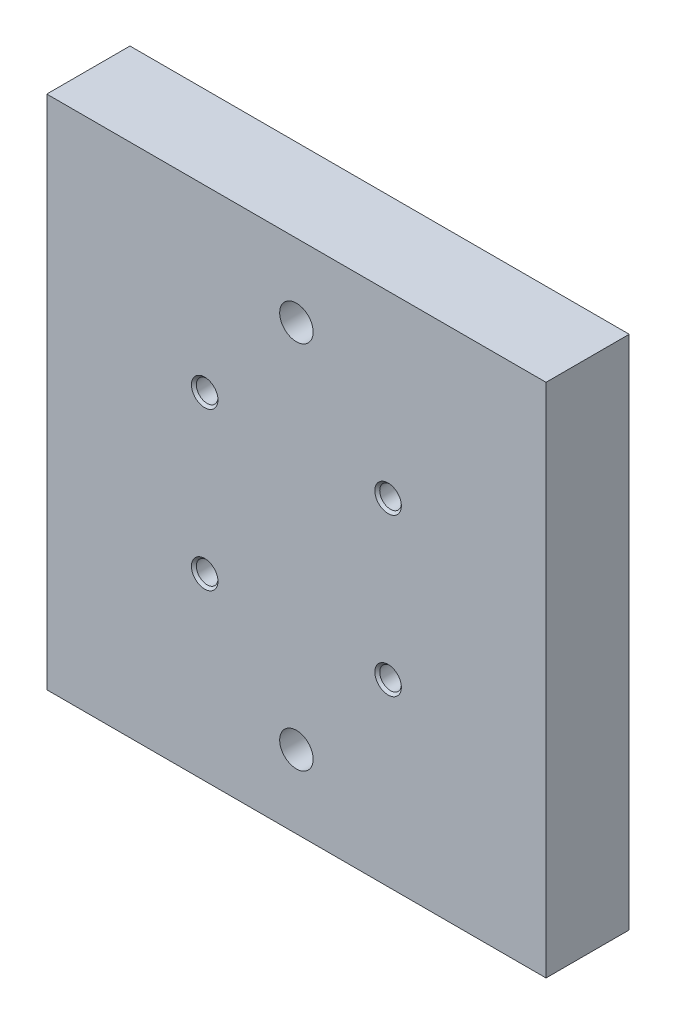
ISO-10303-21;
HEADER;
FILE_DESCRIPTION(('STEP AP214'),'2;1');
FILE_NAME('part.step','',(''),(''),'','','');
FILE_SCHEMA(('AUTOMOTIVE_DESIGN { 1 0 10303 214 1 1 1 1 }'));
ENDSEC;
DATA;
#1=APPLICATION_CONTEXT('core data for automotive mechanical design processes');
#2=APPLICATION_PROTOCOL_DEFINITION('international standard','automotive_design',2000,#1);
#3=PRODUCT_CONTEXT('',#1,'mechanical');
#4=PRODUCT('Part','Part','',(#3));
#5=PRODUCT_RELATED_PRODUCT_CATEGORY('part','',(#4));
#6=PRODUCT_DEFINITION_FORMATION('','',#4);
#7=PRODUCT_DEFINITION_CONTEXT('part definition',#1,'design');
#8=PRODUCT_DEFINITION('design','',#6,#7);
#9=PRODUCT_DEFINITION_SHAPE('','',#8);
#10=(LENGTH_UNIT() NAMED_UNIT(*) SI_UNIT(.MILLI.,.METRE.));
#11=(NAMED_UNIT(*) PLANE_ANGLE_UNIT() SI_UNIT($,.RADIAN.));
#12=(NAMED_UNIT(*) SI_UNIT($,.STERADIAN.) SOLID_ANGLE_UNIT());
#13=UNCERTAINTY_MEASURE_WITH_UNIT(LENGTH_MEASURE(1.E-05),#10,'distance_accuracy_value','');
#14=(GEOMETRIC_REPRESENTATION_CONTEXT(3) GLOBAL_UNCERTAINTY_ASSIGNED_CONTEXT((#13)) GLOBAL_UNIT_ASSIGNED_CONTEXT((#10,
#11,#12)) REPRESENTATION_CONTEXT('',''));
#15=CARTESIAN_POINT('',(0.,0.,0.));
#16=DIRECTION('',(0.,0.,1.));
#17=DIRECTION('',(1.,0.,0.));
#18=AXIS2_PLACEMENT_3D('',#15,#16,#17);
#19=CARTESIAN_POINT('',(-38.1,-39.37,12.7));
#20=DIRECTION('',(1.,0.,0.));
#21=DIRECTION('',(0.,0.,-1.));
#22=AXIS2_PLACEMENT_3D('',#19,#20,#21);
#23=PLANE('',#22);
#24=DIRECTION('',(0.,-1.,0.));
#25=VECTOR('',#24,1.);
#26=CARTESIAN_POINT('',(-38.1,-39.37,0.));
#27=LINE('',#26,#25);
#28=CARTESIAN_POINT('',(-38.1,39.37,0.));
#29=VERTEX_POINT('',#28);
#30=CARTESIAN_POINT('',(-38.1,-39.37,0.));
#31=VERTEX_POINT('',#30);
#32=EDGE_CURVE('E97',#29,#31,#27,.T.);
#33=ORIENTED_EDGE('',*,*,#32,.T.);
#34=DIRECTION('',(0.,0.,-1.));
#35=VECTOR('',#34,1.);
#36=CARTESIAN_POINT('',(-38.1,-39.37,12.7));
#37=LINE('',#36,#35);
#38=CARTESIAN_POINT('',(-38.1,-39.37,12.7));
#39=VERTEX_POINT('',#38);
#40=EDGE_CURVE('E11',#39,#31,#37,.T.);
#41=ORIENTED_EDGE('',*,*,#40,.F.);
#42=DIRECTION('',(0.,-1.,0.));
#43=VECTOR('',#42,1.);
#44=CARTESIAN_POINT('',(-38.1,-39.37,12.7));
#45=LINE('',#44,#43);
#46=CARTESIAN_POINT('',(-38.1,39.37,12.7));
#47=VERTEX_POINT('',#46);
#48=EDGE_CURVE('E85',#47,#39,#45,.T.);
#49=ORIENTED_EDGE('',*,*,#48,.F.);
#50=DIRECTION('',(0.,0.,-1.));
#51=VECTOR('',#50,1.);
#52=CARTESIAN_POINT('',(-38.1,39.37,12.7));
#53=LINE('',#52,#51);
#54=EDGE_CURVE('E93',#47,#29,#53,.T.);
#55=ORIENTED_EDGE('',*,*,#54,.T.);
#56=EDGE_LOOP('',(#33,#41,#49,#55));
#57=FACE_BOUND('',#56,.T.);
#58=ADVANCED_FACE('F34',(#57),#23,.F.);
#59=CARTESIAN_POINT('',(-38.1,-39.37,12.7));
#60=DIRECTION('',(0.,1.,0.));
#61=DIRECTION('',(-1.,0.,0.));
#62=AXIS2_PLACEMENT_3D('',#59,#60,#61);
#63=PLANE('',#62);
#64=DIRECTION('',(1.,0.,0.));
#65=VECTOR('',#64,1.);
#66=CARTESIAN_POINT('',(-38.1,-39.37,0.));
#67=LINE('',#66,#65);
#68=CARTESIAN_POINT('',(38.1,-39.37,0.));
#69=VERTEX_POINT('',#68);
#70=EDGE_CURVE('E89',#31,#69,#67,.T.);
#71=ORIENTED_EDGE('',*,*,#70,.T.);
#72=DIRECTION('',(0.,0.,-1.));
#73=VECTOR('',#72,1.);
#74=CARTESIAN_POINT('',(38.1,-39.37,12.7));
#75=LINE('',#74,#73);
#76=CARTESIAN_POINT('',(38.1,-39.37,12.7));
#77=VERTEX_POINT('',#76);
#78=EDGE_CURVE('E42',#77,#69,#75,.T.);
#79=ORIENTED_EDGE('',*,*,#78,.F.);
#80=DIRECTION('',(1.,0.,0.));
#81=VECTOR('',#80,1.);
#82=CARTESIAN_POINT('',(-38.1,-39.37,12.7));
#83=LINE('',#82,#81);
#84=EDGE_CURVE('E80',#39,#77,#83,.T.);
#85=ORIENTED_EDGE('',*,*,#84,.F.);
#86=ORIENTED_EDGE('',*,*,#40,.T.);
#87=EDGE_LOOP('',(#71,#79,#85,#86));
#88=FACE_BOUND('',#87,.T.);
#89=ADVANCED_FACE('F88',(#88),#63,.F.);
#90=CARTESIAN_POINT('',(38.1,-39.37,12.7));
#91=DIRECTION('',(-1.,0.,0.));
#92=DIRECTION('',(0.,0.,1.));
#93=AXIS2_PLACEMENT_3D('',#90,#91,#92);
#94=PLANE('',#93);
#95=DIRECTION('',(0.,1.,0.));
#96=VECTOR('',#95,1.);
#97=CARTESIAN_POINT('',(38.1,-39.37,0.));
#98=LINE('',#97,#96);
#99=CARTESIAN_POINT('',(38.1,39.37,0.));
#100=VERTEX_POINT('',#99);
#101=EDGE_CURVE('E67',#69,#100,#98,.T.);
#102=ORIENTED_EDGE('',*,*,#101,.T.);
#103=DIRECTION('',(0.,0.,-1.));
#104=VECTOR('',#103,1.);
#105=CARTESIAN_POINT('',(38.1,39.37,12.7));
#106=LINE('',#105,#104);
#107=CARTESIAN_POINT('',(38.1,39.37,12.7));
#108=VERTEX_POINT('',#107);
#109=EDGE_CURVE('E90',#108,#100,#106,.T.);
#110=ORIENTED_EDGE('',*,*,#109,.F.);
#111=DIRECTION('',(0.,1.,0.));
#112=VECTOR('',#111,1.);
#113=CARTESIAN_POINT('',(38.1,-39.37,12.7));
#114=LINE('',#113,#112);
#115=EDGE_CURVE('E83',#77,#108,#114,.T.);
#116=ORIENTED_EDGE('',*,*,#115,.F.);
#117=ORIENTED_EDGE('',*,*,#78,.T.);
#118=EDGE_LOOP('',(#102,#110,#116,#117));
#119=FACE_BOUND('',#118,.T.);
#120=ADVANCED_FACE('F91',(#119),#94,.F.);
#121=CARTESIAN_POINT('',(-38.1,39.37,12.7));
#122=DIRECTION('',(0.,-1.,0.));
#123=DIRECTION('',(1.,0.,0.));
#124=AXIS2_PLACEMENT_3D('',#121,#122,#123);
#125=PLANE('',#124);
#126=DIRECTION('',(-1.,0.,0.));
#127=VECTOR('',#126,1.);
#128=CARTESIAN_POINT('',(-38.1,39.37,0.));
#129=LINE('',#128,#127);
#130=EDGE_CURVE('E73',#100,#29,#129,.T.);
#131=ORIENTED_EDGE('',*,*,#130,.T.);
#132=ORIENTED_EDGE('',*,*,#54,.F.);
#133=DIRECTION('',(-1.,0.,0.));
#134=VECTOR('',#133,1.);
#135=CARTESIAN_POINT('',(-38.1,39.37,12.7));
#136=LINE('',#135,#134);
#137=EDGE_CURVE('E50',#108,#47,#136,.T.);
#138=ORIENTED_EDGE('',*,*,#137,.F.);
#139=ORIENTED_EDGE('',*,*,#109,.T.);
#140=EDGE_LOOP('',(#131,#132,#138,#139));
#141=FACE_BOUND('',#140,.T.);
#142=ADVANCED_FACE('F105',(#141),#125,.F.);
#143=CARTESIAN_POINT('',(0.,0.,12.7));
#144=DIRECTION('',(0.,0.,-1.));
#145=DIRECTION('',(-1.,0.,0.));
#146=AXIS2_PLACEMENT_3D('',#143,#144,#145);
#147=PLANE('',#146);
#148=CARTESIAN_POINT('',(13.9954,11.9888,12.7));
#149=DIRECTION('',(0.,0.,-1.));
#150=DIRECTION('',(-1.,0.,0.));
#151=AXIS2_PLACEMENT_3D('',#148,#149,#150);
#152=CIRCLE('',#151,2.025);
#153=CARTESIAN_POINT('',(11.9704,11.9888,12.7));
#154=VERTEX_POINT('',#153);
#155=EDGE_CURVE('E173',#154,#154,#152,.T.);
#156=ORIENTED_EDGE('',*,*,#155,.T.);
#157=EDGE_LOOP('',(#156));
#158=FACE_BOUND('',#157,.T.);
#159=CARTESIAN_POINT('',(-13.9954,11.9888,12.7));
#160=DIRECTION('',(0.,0.,-1.));
#161=DIRECTION('',(-1.,0.,0.));
#162=AXIS2_PLACEMENT_3D('',#159,#160,#161);
#163=CIRCLE('',#162,2.025);
#164=CARTESIAN_POINT('',(-16.0204,11.9888,12.7));
#165=VERTEX_POINT('',#164);
#166=EDGE_CURVE('E161',#165,#165,#163,.T.);
#167=ORIENTED_EDGE('',*,*,#166,.T.);
#168=EDGE_LOOP('',(#167));
#169=FACE_BOUND('',#168,.T.);
#170=CARTESIAN_POINT('',(-13.9954,-11.9888,12.7));
#171=DIRECTION('',(0.,0.,-1.));
#172=DIRECTION('',(-1.,0.,0.));
#173=AXIS2_PLACEMENT_3D('',#170,#171,#172);
#174=CIRCLE('',#173,2.025);
#175=CARTESIAN_POINT('',(-16.0204,-11.9888,12.7));
#176=VERTEX_POINT('',#175);
#177=EDGE_CURVE('E149',#176,#176,#174,.T.);
#178=ORIENTED_EDGE('',*,*,#177,.T.);
#179=EDGE_LOOP('',(#178));
#180=FACE_BOUND('',#179,.T.);
#181=CARTESIAN_POINT('',(13.9954,-11.9888,12.7));
#182=DIRECTION('',(0.,0.,-1.));
#183=DIRECTION('',(-1.,0.,0.));
#184=AXIS2_PLACEMENT_3D('',#181,#182,#183);
#185=CIRCLE('',#184,2.025);
#186=CARTESIAN_POINT('',(11.9704,-11.9888,12.7));
#187=VERTEX_POINT('',#186);
#188=EDGE_CURVE('E137',#187,#187,#185,.T.);
#189=ORIENTED_EDGE('',*,*,#188,.T.);
#190=EDGE_LOOP('',(#189));
#191=FACE_BOUND('',#190,.T.);
#192=CARTESIAN_POINT('',(0.,28.2321,12.7));
#193=DIRECTION('',(0.,0.,-1.));
#194=DIRECTION('',(-1.,0.,0.));
#195=AXIS2_PLACEMENT_3D('',#192,#193,#194);
#196=CIRCLE('',#195,2.55269999999999);
#197=CARTESIAN_POINT('',(-2.5527,28.2321,12.7));
#198=VERTEX_POINT('',#197);
#199=EDGE_CURVE('E119',#198,#198,#196,.T.);
#200=ORIENTED_EDGE('',*,*,#199,.T.);
#201=EDGE_LOOP('',(#200));
#202=FACE_BOUND('',#201,.T.);
#203=CARTESIAN_POINT('',(0.,-28.2321,12.7));
#204=DIRECTION('',(0.,0.,-1.));
#205=DIRECTION('',(-1.,0.,0.));
#206=AXIS2_PLACEMENT_3D('',#203,#204,#205);
#207=CIRCLE('',#206,2.55269999999999);
#208=CARTESIAN_POINT('',(-2.5527,-28.2321,12.7));
#209=VERTEX_POINT('',#208);
#210=EDGE_CURVE('E100',#209,#209,#207,.T.);
#211=ORIENTED_EDGE('',*,*,#210,.T.);
#212=EDGE_LOOP('',(#211));
#213=FACE_BOUND('',#212,.T.);
#214=ORIENTED_EDGE('',*,*,#48,.T.);
#215=ORIENTED_EDGE('',*,*,#84,.T.);
#216=ORIENTED_EDGE('',*,*,#115,.T.);
#217=ORIENTED_EDGE('',*,*,#137,.T.);
#218=EDGE_LOOP('',(#214,#215,#216,#217));
#219=FACE_BOUND('',#218,.T.);
#220=ADVANCED_FACE('F81',(#158,#169,#180,#191,#202,#213,#219),#147,.F.);
#221=CARTESIAN_POINT('',(0.,0.,0.));
#222=DIRECTION('',(0.,0.,-1.));
#223=DIRECTION('',(-1.,0.,0.));
#224=AXIS2_PLACEMENT_3D('',#221,#222,#223);
#225=PLANE('',#224);
#226=CARTESIAN_POINT('',(13.9954,11.9888,0.));
#227=DIRECTION('',(0.,0.,-1.));
#228=DIRECTION('',(-1.,0.,0.));
#229=AXIS2_PLACEMENT_3D('',#226,#227,#228);
#230=CIRCLE('',#229,2.025);
#231=CARTESIAN_POINT('',(11.9704,11.9888,0.));
#232=VERTEX_POINT('',#231);
#233=EDGE_CURVE('E170',#232,#232,#230,.T.);
#234=ORIENTED_EDGE('',*,*,#233,.F.);
#235=EDGE_LOOP('',(#234));
#236=FACE_BOUND('',#235,.T.);
#237=CARTESIAN_POINT('',(-13.9954,11.9888,0.));
#238=DIRECTION('',(0.,0.,-1.));
#239=DIRECTION('',(-1.,0.,0.));
#240=AXIS2_PLACEMENT_3D('',#237,#238,#239);
#241=CIRCLE('',#240,2.025);
#242=CARTESIAN_POINT('',(-16.0204,11.9888,0.));
#243=VERTEX_POINT('',#242);
#244=EDGE_CURVE('E158',#243,#243,#241,.T.);
#245=ORIENTED_EDGE('',*,*,#244,.F.);
#246=EDGE_LOOP('',(#245));
#247=FACE_BOUND('',#246,.T.);
#248=CARTESIAN_POINT('',(-13.9954,-11.9888,0.));
#249=DIRECTION('',(0.,0.,-1.));
#250=DIRECTION('',(-1.,0.,0.));
#251=AXIS2_PLACEMENT_3D('',#248,#249,#250);
#252=CIRCLE('',#251,2.025);
#253=CARTESIAN_POINT('',(-16.0204,-11.9888,0.));
#254=VERTEX_POINT('',#253);
#255=EDGE_CURVE('E146',#254,#254,#252,.T.);
#256=ORIENTED_EDGE('',*,*,#255,.F.);
#257=EDGE_LOOP('',(#256));
#258=FACE_BOUND('',#257,.T.);
#259=CARTESIAN_POINT('',(13.9954,-11.9888,0.));
#260=DIRECTION('',(0.,0.,-1.));
#261=DIRECTION('',(-1.,0.,0.));
#262=AXIS2_PLACEMENT_3D('',#259,#260,#261);
#263=CIRCLE('',#262,2.025);
#264=CARTESIAN_POINT('',(11.9704,-11.9888,0.));
#265=VERTEX_POINT('',#264);
#266=EDGE_CURVE('E134',#265,#265,#263,.T.);
#267=ORIENTED_EDGE('',*,*,#266,.F.);
#268=EDGE_LOOP('',(#267));
#269=FACE_BOUND('',#268,.T.);
#270=CARTESIAN_POINT('',(0.,28.2321,0.));
#271=DIRECTION('',(0.,0.,-1.));
#272=DIRECTION('',(-1.,0.,0.));
#273=AXIS2_PLACEMENT_3D('',#270,#271,#272);
#274=CIRCLE('',#273,3.81);
#275=CARTESIAN_POINT('',(-3.81000000000001,28.2321,0.));
#276=VERTEX_POINT('',#275);
#277=EDGE_CURVE('E125',#276,#276,#274,.T.);
#278=ORIENTED_EDGE('',*,*,#277,.F.);
#279=EDGE_LOOP('',(#278));
#280=FACE_BOUND('',#279,.T.);
#281=CARTESIAN_POINT('',(0.,-28.2321,0.));
#282=DIRECTION('',(0.,0.,-1.));
#283=DIRECTION('',(-1.,0.,0.));
#284=AXIS2_PLACEMENT_3D('',#281,#282,#283);
#285=CIRCLE('',#284,3.81);
#286=CARTESIAN_POINT('',(-3.81000000000001,-28.2321,0.));
#287=VERTEX_POINT('',#286);
#288=EDGE_CURVE('E116',#287,#287,#285,.T.);
#289=ORIENTED_EDGE('',*,*,#288,.F.);
#290=EDGE_LOOP('',(#289));
#291=FACE_BOUND('',#290,.T.);
#292=ORIENTED_EDGE('',*,*,#32,.F.);
#293=ORIENTED_EDGE('',*,*,#130,.F.);
#294=ORIENTED_EDGE('',*,*,#101,.F.);
#295=ORIENTED_EDGE('',*,*,#70,.F.);
#296=EDGE_LOOP('',(#292,#293,#294,#295));
#297=FACE_BOUND('',#296,.T.);
#298=ADVANCED_FACE('F108',(#236,#247,#258,#269,#280,#291,#297),#225,.T.);
#299=CARTESIAN_POINT('',(0.,-28.2321,0.));
#300=DIRECTION('',(0.,0.,-1.));
#301=DIRECTION('',(-1.,0.,0.));
#302=AXIS2_PLACEMENT_3D('',#299,#300,#301);
#303=CYLINDRICAL_SURFACE('',#302,2.55269999999999);
#304=ORIENTED_EDGE('',*,*,#210,.F.);
#305=EDGE_LOOP('',(#304));
#306=FACE_BOUND('',#305,.T.);
#307=CARTESIAN_POINT('',(0.,-28.2321,1.2573));
#308=DIRECTION('',(0.,0.,-1.));
#309=DIRECTION('',(-1.,0.,0.));
#310=AXIS2_PLACEMENT_3D('',#307,#308,#309);
#311=CIRCLE('',#310,2.5527);
#312=CARTESIAN_POINT('',(-2.55270000000001,-28.2321,1.2573));
#313=VERTEX_POINT('',#312);
#314=EDGE_CURVE('E113',#313,#313,#311,.T.);
#315=ORIENTED_EDGE('',*,*,#314,.T.);
#316=EDGE_LOOP('',(#315));
#317=FACE_BOUND('',#316,.T.);
#318=ADVANCED_FACE('F200',(#306,#317),#303,.F.);
#319=CARTESIAN_POINT('',(0.,-28.2321,0.));
#320=DIRECTION('',(0.,0.,-1.));
#321=DIRECTION('',(-1.,0.,0.));
#322=AXIS2_PLACEMENT_3D('',#319,#320,#321);
#323=CONICAL_SURFACE('',#322,3.81,0.785398163397449);
#324=ORIENTED_EDGE('',*,*,#314,.F.);
#325=EDGE_LOOP('',(#324));
#326=FACE_BOUND('',#325,.T.);
#327=ORIENTED_EDGE('',*,*,#288,.T.);
#328=EDGE_LOOP('',(#327));
#329=FACE_BOUND('',#328,.T.);
#330=ADVANCED_FACE('F212',(#326,#329),#323,.F.);
#331=CARTESIAN_POINT('',(0.,28.2321,0.));
#332=DIRECTION('',(0.,0.,-1.));
#333=DIRECTION('',(-1.,0.,0.));
#334=AXIS2_PLACEMENT_3D('',#331,#332,#333);
#335=CYLINDRICAL_SURFACE('',#334,2.55269999999999);
#336=ORIENTED_EDGE('',*,*,#199,.F.);
#337=EDGE_LOOP('',(#336));
#338=FACE_BOUND('',#337,.T.);
#339=CARTESIAN_POINT('',(0.,28.2321,1.2573));
#340=DIRECTION('',(0.,0.,-1.));
#341=DIRECTION('',(-1.,0.,0.));
#342=AXIS2_PLACEMENT_3D('',#339,#340,#341);
#343=CIRCLE('',#342,2.5527);
#344=CARTESIAN_POINT('',(-2.55270000000001,28.2321,1.2573));
#345=VERTEX_POINT('',#344);
#346=EDGE_CURVE('E122',#345,#345,#343,.T.);
#347=ORIENTED_EDGE('',*,*,#346,.T.);
#348=EDGE_LOOP('',(#347));
#349=FACE_BOUND('',#348,.T.);
#350=ADVANCED_FACE('F214',(#338,#349),#335,.F.);
#351=CARTESIAN_POINT('',(0.,28.2321,0.));
#352=DIRECTION('',(0.,0.,-1.));
#353=DIRECTION('',(-1.,0.,0.));
#354=AXIS2_PLACEMENT_3D('',#351,#352,#353);
#355=CONICAL_SURFACE('',#354,3.81,0.785398163397449);
#356=ORIENTED_EDGE('',*,*,#346,.F.);
#357=EDGE_LOOP('',(#356));
#358=FACE_BOUND('',#357,.T.);
#359=ORIENTED_EDGE('',*,*,#277,.T.);
#360=EDGE_LOOP('',(#359));
#361=FACE_BOUND('',#360,.T.);
#362=ADVANCED_FACE('F221',(#358,#361),#355,.F.);
#363=CARTESIAN_POINT('',(13.9954,-11.9888,12.325));
#364=DIRECTION('',(0.,0.,1.));
#365=DIRECTION('',(1.,0.,0.));
#366=AXIS2_PLACEMENT_3D('',#363,#364,#365);
#367=CONICAL_SURFACE('',#366,1.65,0.785398163397444);
#368=ORIENTED_EDGE('',*,*,#188,.F.);
#369=EDGE_LOOP('',(#368));
#370=FACE_BOUND('',#369,.T.);
#371=CARTESIAN_POINT('',(13.9954,-11.9888,12.325));
#372=DIRECTION('',(0.,0.,-1.));
#373=DIRECTION('',(-1.,0.,0.));
#374=AXIS2_PLACEMENT_3D('',#371,#372,#373);
#375=CIRCLE('',#374,1.65);
#376=CARTESIAN_POINT('',(12.3454,-11.9888,12.325));
#377=VERTEX_POINT('',#376);
#378=EDGE_CURVE('E128',#377,#377,#375,.T.);
#379=ORIENTED_EDGE('',*,*,#378,.T.);
#380=EDGE_LOOP('',(#379));
#381=FACE_BOUND('',#380,.T.);
#382=ADVANCED_FACE('F273',(#370,#381),#367,.F.);
#383=CARTESIAN_POINT('',(13.9954,-11.9888,0.));
#384=DIRECTION('',(0.,0.,-1.));
#385=DIRECTION('',(-1.,0.,0.));
#386=AXIS2_PLACEMENT_3D('',#383,#384,#385);
#387=CYLINDRICAL_SURFACE('',#386,1.65);
#388=ORIENTED_EDGE('',*,*,#378,.F.);
#389=EDGE_LOOP('',(#388));
#390=FACE_BOUND('',#389,.T.);
#391=CARTESIAN_POINT('',(13.9954,-11.9888,0.374999999999999));
#392=DIRECTION('',(0.,0.,-1.));
#393=DIRECTION('',(-1.,0.,0.));
#394=AXIS2_PLACEMENT_3D('',#391,#392,#393);
#395=CIRCLE('',#394,1.65);
#396=CARTESIAN_POINT('',(12.3454,-11.9888,0.374999999999999));
#397=VERTEX_POINT('',#396);
#398=EDGE_CURVE('E131',#397,#397,#395,.T.);
#399=ORIENTED_EDGE('',*,*,#398,.T.);
#400=EDGE_LOOP('',(#399));
#401=FACE_BOUND('',#400,.T.);
#402=ADVANCED_FACE('F283',(#390,#401),#387,.F.);
#403=CARTESIAN_POINT('',(13.9954,-11.9888,0.));
#404=DIRECTION('',(0.,0.,-1.));
#405=DIRECTION('',(-1.,0.,0.));
#406=AXIS2_PLACEMENT_3D('',#403,#404,#405);
#407=CONICAL_SURFACE('',#406,2.025,0.785398163397451);
#408=ORIENTED_EDGE('',*,*,#398,.F.);
#409=EDGE_LOOP('',(#408));
#410=FACE_BOUND('',#409,.T.);
#411=ORIENTED_EDGE('',*,*,#266,.T.);
#412=EDGE_LOOP('',(#411));
#413=FACE_BOUND('',#412,.T.);
#414=ADVANCED_FACE('F290',(#410,#413),#407,.F.);
#415=CARTESIAN_POINT('',(-13.9954,-11.9888,12.325));
#416=DIRECTION('',(0.,0.,1.));
#417=DIRECTION('',(1.,0.,0.));
#418=AXIS2_PLACEMENT_3D('',#415,#416,#417);
#419=CONICAL_SURFACE('',#418,1.65,0.785398163397448);
#420=ORIENTED_EDGE('',*,*,#177,.F.);
#421=EDGE_LOOP('',(#420));
#422=FACE_BOUND('',#421,.T.);
#423=CARTESIAN_POINT('',(-13.9954,-11.9888,12.325));
#424=DIRECTION('',(0.,0.,-1.));
#425=DIRECTION('',(-1.,0.,0.));
#426=AXIS2_PLACEMENT_3D('',#423,#424,#425);
#427=CIRCLE('',#426,1.65);
#428=CARTESIAN_POINT('',(-15.6454,-11.9888,12.325));
#429=VERTEX_POINT('',#428);
#430=EDGE_CURVE('E140',#429,#429,#427,.T.);
#431=ORIENTED_EDGE('',*,*,#430,.T.);
#432=EDGE_LOOP('',(#431));
#433=FACE_BOUND('',#432,.T.);
#434=ADVANCED_FACE('F298',(#422,#433),#419,.F.);
#435=CARTESIAN_POINT('',(-13.9954,-11.9888,0.));
#436=DIRECTION('',(0.,0.,-1.));
#437=DIRECTION('',(-1.,0.,0.));
#438=AXIS2_PLACEMENT_3D('',#435,#436,#437);
#439=CYLINDRICAL_SURFACE('',#438,1.65);
#440=ORIENTED_EDGE('',*,*,#430,.F.);
#441=EDGE_LOOP('',(#440));
#442=FACE_BOUND('',#441,.T.);
#443=CARTESIAN_POINT('',(-13.9954,-11.9888,0.374999999999999));
#444=DIRECTION('',(0.,0.,-1.));
#445=DIRECTION('',(-1.,0.,0.));
#446=AXIS2_PLACEMENT_3D('',#443,#444,#445);
#447=CIRCLE('',#446,1.65);
#448=CARTESIAN_POINT('',(-15.6454,-11.9888,0.374999999999999));
#449=VERTEX_POINT('',#448);
#450=EDGE_CURVE('E143',#449,#449,#447,.T.);
#451=ORIENTED_EDGE('',*,*,#450,.T.);
#452=EDGE_LOOP('',(#451));
#453=FACE_BOUND('',#452,.T.);
#454=ADVANCED_FACE('F306',(#442,#453),#439,.F.);
#455=CARTESIAN_POINT('',(-13.9954,-11.9888,0.));
#456=DIRECTION('',(0.,0.,-1.));
#457=DIRECTION('',(-1.,0.,0.));
#458=AXIS2_PLACEMENT_3D('',#455,#456,#457);
#459=CONICAL_SURFACE('',#458,2.025,0.785398163397451);
#460=ORIENTED_EDGE('',*,*,#450,.F.);
#461=EDGE_LOOP('',(#460));
#462=FACE_BOUND('',#461,.T.);
#463=ORIENTED_EDGE('',*,*,#255,.T.);
#464=EDGE_LOOP('',(#463));
#465=FACE_BOUND('',#464,.T.);
#466=ADVANCED_FACE('F314',(#462,#465),#459,.F.);
#467=CARTESIAN_POINT('',(-13.9954,11.9888,12.325));
#468=DIRECTION('',(0.,0.,1.));
#469=DIRECTION('',(1.,0.,0.));
#470=AXIS2_PLACEMENT_3D('',#467,#468,#469);
#471=CONICAL_SURFACE('',#470,1.65,0.785398163397448);
#472=ORIENTED_EDGE('',*,*,#166,.F.);
#473=EDGE_LOOP('',(#472));
#474=FACE_BOUND('',#473,.T.);
#475=CARTESIAN_POINT('',(-13.9954,11.9888,12.325));
#476=DIRECTION('',(0.,0.,-1.));
#477=DIRECTION('',(-1.,0.,0.));
#478=AXIS2_PLACEMENT_3D('',#475,#476,#477);
#479=CIRCLE('',#478,1.65);
#480=CARTESIAN_POINT('',(-15.6454,11.9888,12.325));
#481=VERTEX_POINT('',#480);
#482=EDGE_CURVE('E152',#481,#481,#479,.T.);
#483=ORIENTED_EDGE('',*,*,#482,.T.);
#484=EDGE_LOOP('',(#483));
#485=FACE_BOUND('',#484,.T.);
#486=ADVANCED_FACE('F322',(#474,#485),#471,.F.);
#487=CARTESIAN_POINT('',(-13.9954,11.9888,0.));
#488=DIRECTION('',(0.,0.,-1.));
#489=DIRECTION('',(-1.,0.,0.));
#490=AXIS2_PLACEMENT_3D('',#487,#488,#489);
#491=CYLINDRICAL_SURFACE('',#490,1.65);
#492=ORIENTED_EDGE('',*,*,#482,.F.);
#493=EDGE_LOOP('',(#492));
#494=FACE_BOUND('',#493,.T.);
#495=CARTESIAN_POINT('',(-13.9954,11.9888,0.374999999999999));
#496=DIRECTION('',(0.,0.,-1.));
#497=DIRECTION('',(-1.,0.,0.));
#498=AXIS2_PLACEMENT_3D('',#495,#496,#497);
#499=CIRCLE('',#498,1.65);
#500=CARTESIAN_POINT('',(-15.6454,11.9888,0.374999999999999));
#501=VERTEX_POINT('',#500);
#502=EDGE_CURVE('E155',#501,#501,#499,.T.);
#503=ORIENTED_EDGE('',*,*,#502,.T.);
#504=EDGE_LOOP('',(#503));
#505=FACE_BOUND('',#504,.T.);
#506=ADVANCED_FACE('F330',(#494,#505),#491,.F.);
#507=CARTESIAN_POINT('',(-13.9954,11.9888,0.));
#508=DIRECTION('',(0.,0.,-1.));
#509=DIRECTION('',(-1.,0.,0.));
#510=AXIS2_PLACEMENT_3D('',#507,#508,#509);
#511=CONICAL_SURFACE('',#510,2.025,0.785398163397451);
#512=ORIENTED_EDGE('',*,*,#502,.F.);
#513=EDGE_LOOP('',(#512));
#514=FACE_BOUND('',#513,.T.);
#515=ORIENTED_EDGE('',*,*,#244,.T.);
#516=EDGE_LOOP('',(#515));
#517=FACE_BOUND('',#516,.T.);
#518=ADVANCED_FACE('F183',(#514,#517),#511,.F.);
#519=CARTESIAN_POINT('',(13.9954,11.9888,12.325));
#520=DIRECTION('',(0.,0.,1.));
#521=DIRECTION('',(1.,0.,0.));
#522=AXIS2_PLACEMENT_3D('',#519,#520,#521);
#523=CONICAL_SURFACE('',#522,1.65,0.785398163397444);
#524=ORIENTED_EDGE('',*,*,#155,.F.);
#525=EDGE_LOOP('',(#524));
#526=FACE_BOUND('',#525,.T.);
#527=CARTESIAN_POINT('',(13.9954,11.9888,12.325));
#528=DIRECTION('',(0.,0.,-1.));
#529=DIRECTION('',(-1.,0.,0.));
#530=AXIS2_PLACEMENT_3D('',#527,#528,#529);
#531=CIRCLE('',#530,1.65);
#532=CARTESIAN_POINT('',(12.3454,11.9888,12.325));
#533=VERTEX_POINT('',#532);
#534=EDGE_CURVE('E164',#533,#533,#531,.T.);
#535=ORIENTED_EDGE('',*,*,#534,.T.);
#536=EDGE_LOOP('',(#535));
#537=FACE_BOUND('',#536,.T.);
#538=ADVANCED_FACE('F179',(#526,#537),#523,.F.);
#539=CARTESIAN_POINT('',(13.9954,11.9888,0.));
#540=DIRECTION('',(0.,0.,-1.));
#541=DIRECTION('',(-1.,0.,0.));
#542=AXIS2_PLACEMENT_3D('',#539,#540,#541);
#543=CYLINDRICAL_SURFACE('',#542,1.65);
#544=ORIENTED_EDGE('',*,*,#534,.F.);
#545=EDGE_LOOP('',(#544));
#546=FACE_BOUND('',#545,.T.);
#547=CARTESIAN_POINT('',(13.9954,11.9888,0.374999999999999));
#548=DIRECTION('',(0.,0.,-1.));
#549=DIRECTION('',(-1.,0.,0.));
#550=AXIS2_PLACEMENT_3D('',#547,#548,#549);
#551=CIRCLE('',#550,1.65);
#552=CARTESIAN_POINT('',(12.3454,11.9888,0.374999999999999));
#553=VERTEX_POINT('',#552);
#554=EDGE_CURVE('E167',#553,#553,#551,.T.);
#555=ORIENTED_EDGE('',*,*,#554,.T.);
#556=EDGE_LOOP('',(#555));
#557=FACE_BOUND('',#556,.T.);
#558=ADVANCED_FACE('F182',(#546,#557),#543,.F.);
#559=CARTESIAN_POINT('',(13.9954,11.9888,0.));
#560=DIRECTION('',(0.,0.,-1.));
#561=DIRECTION('',(-1.,0.,0.));
#562=AXIS2_PLACEMENT_3D('',#559,#560,#561);
#563=CONICAL_SURFACE('',#562,2.025,0.785398163397451);
#564=ORIENTED_EDGE('',*,*,#554,.F.);
#565=EDGE_LOOP('',(#564));
#566=FACE_BOUND('',#565,.T.);
#567=ORIENTED_EDGE('',*,*,#233,.T.);
#568=EDGE_LOOP('',(#567));
#569=FACE_BOUND('',#568,.T.);
#570=ADVANCED_FACE('F189',(#566,#569),#563,.F.);
#571=CLOSED_SHELL('',(#58,#89,#120,#142,#220,#298,#318,#330,#350,#362,#382,#402,#414,#434,#454,
#466,#486,#506,#518,#538,#558,#570));
#572=MANIFOLD_SOLID_BREP('B2',#571);
#573=ADVANCED_BREP_SHAPE_REPRESENTATION('',(#18,#572),#14);
#574=SHAPE_DEFINITION_REPRESENTATION(#9,#573);
ENDSEC;
END-ISO-10303-21;
